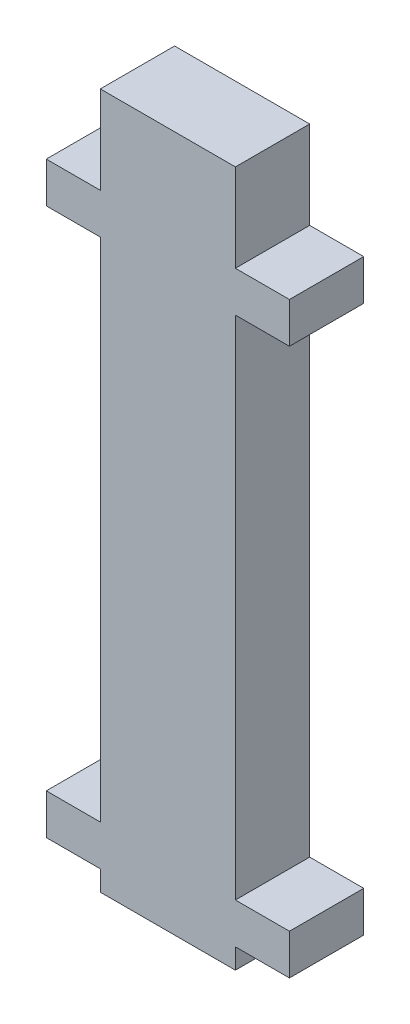
ISO-10303-21;
HEADER;
FILE_DESCRIPTION(('STEP AP214'),'2;1');
FILE_NAME('part.step','',(''),(''),'','','');
FILE_SCHEMA(('AUTOMOTIVE_DESIGN { 1 0 10303 214 1 1 1 1 }'));
ENDSEC;
DATA;
#1=APPLICATION_CONTEXT('core data for automotive mechanical design processes');
#2=APPLICATION_PROTOCOL_DEFINITION('international standard','automotive_design',2000,#1);
#3=PRODUCT_CONTEXT('',#1,'mechanical');
#4=PRODUCT('Part','Part','',(#3));
#5=PRODUCT_RELATED_PRODUCT_CATEGORY('part','',(#4));
#6=PRODUCT_DEFINITION_FORMATION('','',#4);
#7=PRODUCT_DEFINITION_CONTEXT('part definition',#1,'design');
#8=PRODUCT_DEFINITION('design','',#6,#7);
#9=PRODUCT_DEFINITION_SHAPE('','',#8);
#10=(LENGTH_UNIT() NAMED_UNIT(*) SI_UNIT(.MILLI.,.METRE.));
#11=(NAMED_UNIT(*) PLANE_ANGLE_UNIT() SI_UNIT($,.RADIAN.));
#12=(NAMED_UNIT(*) SI_UNIT($,.STERADIAN.) SOLID_ANGLE_UNIT());
#13=UNCERTAINTY_MEASURE_WITH_UNIT(LENGTH_MEASURE(1.E-05),#10,'distance_accuracy_value','');
#14=(GEOMETRIC_REPRESENTATION_CONTEXT(3) GLOBAL_UNCERTAINTY_ASSIGNED_CONTEXT((#13)) GLOBAL_UNIT_ASSIGNED_CONTEXT((#10,
#11,#12)) REPRESENTATION_CONTEXT('',''));
#15=CARTESIAN_POINT('',(0.,0.,0.));
#16=DIRECTION('',(0.,0.,1.));
#17=DIRECTION('',(1.,0.,0.));
#18=AXIS2_PLACEMENT_3D('',#15,#16,#17);
#19=CARTESIAN_POINT('',(0.,0.,11.));
#20=DIRECTION('',(1.,0.,0.));
#21=DIRECTION('',(0.,1.,0.));
#22=AXIS2_PLACEMENT_3D('',#19,#20,#21);
#23=PLANE('',#22);
#24=DIRECTION('',(0.,-1.,0.));
#25=VECTOR('',#24,1.);
#26=CARTESIAN_POINT('',(0.,0.,0.));
#27=LINE('',#26,#25);
#28=CARTESIAN_POINT('',(0.,0.,0.));
#29=VERTEX_POINT('',#28);
#30=CARTESIAN_POINT('',(0.,-3.,0.));
#31=VERTEX_POINT('',#30);
#32=EDGE_CURVE('E201',#29,#31,#27,.T.);
#33=ORIENTED_EDGE('',*,*,#32,.T.);
#34=DIRECTION('',(0.,0.,-1.));
#35=VECTOR('',#34,1.);
#36=CARTESIAN_POINT('',(0.,-3.,11.));
#37=LINE('',#36,#35);
#38=CARTESIAN_POINT('',(0.,-3.,11.));
#39=VERTEX_POINT('',#38);
#40=EDGE_CURVE('E11',#39,#31,#37,.T.);
#41=ORIENTED_EDGE('',*,*,#40,.F.);
#42=DIRECTION('',(0.,-1.,0.));
#43=VECTOR('',#42,1.);
#44=CARTESIAN_POINT('',(0.,0.,11.));
#45=LINE('',#44,#43);
#46=CARTESIAN_POINT('',(0.,0.,11.));
#47=VERTEX_POINT('',#46);
#48=EDGE_CURVE('E240',#47,#39,#45,.T.);
#49=ORIENTED_EDGE('',*,*,#48,.F.);
#50=DIRECTION('',(0.,0.,-1.));
#51=VECTOR('',#50,1.);
#52=CARTESIAN_POINT('',(0.,0.,11.));
#53=LINE('',#52,#51);
#54=EDGE_CURVE('E197',#47,#29,#53,.T.);
#55=ORIENTED_EDGE('',*,*,#54,.T.);
#56=EDGE_LOOP('',(#33,#41,#49,#55));
#57=FACE_BOUND('',#56,.T.);
#58=ADVANCED_FACE('F33',(#57),#23,.F.);
#59=CARTESIAN_POINT('',(0.,-3.,11.));
#60=DIRECTION('',(0.,1.,0.));
#61=DIRECTION('',(-1.,0.,0.));
#62=AXIS2_PLACEMENT_3D('',#59,#60,#61);
#63=PLANE('',#62);
#64=DIRECTION('',(1.,0.,0.));
#65=VECTOR('',#64,1.);
#66=CARTESIAN_POINT('',(0.,-3.,0.));
#67=LINE('',#66,#65);
#68=CARTESIAN_POINT('',(20.,-3.,0.));
#69=VERTEX_POINT('',#68);
#70=EDGE_CURVE('E204',#31,#69,#67,.T.);
#71=ORIENTED_EDGE('',*,*,#70,.T.);
#72=DIRECTION('',(0.,0.,-1.));
#73=VECTOR('',#72,1.);
#74=CARTESIAN_POINT('',(20.,-3.,11.));
#75=LINE('',#74,#73);
#76=CARTESIAN_POINT('',(20.,-3.,11.));
#77=VERTEX_POINT('',#76);
#78=EDGE_CURVE('E41',#77,#69,#75,.T.);
#79=ORIENTED_EDGE('',*,*,#78,.F.);
#80=DIRECTION('',(1.,0.,0.));
#81=VECTOR('',#80,1.);
#82=CARTESIAN_POINT('',(0.,-3.,11.));
#83=LINE('',#82,#81);
#84=EDGE_CURVE('E128',#39,#77,#83,.T.);
#85=ORIENTED_EDGE('',*,*,#84,.F.);
#86=ORIENTED_EDGE('',*,*,#40,.T.);
#87=EDGE_LOOP('',(#71,#79,#85,#86));
#88=FACE_BOUND('',#87,.T.);
#89=ADVANCED_FACE('F358',(#88),#63,.F.);
#90=CARTESIAN_POINT('',(20.,-3.,11.));
#91=DIRECTION('',(-1.,0.,0.));
#92=DIRECTION('',(0.,0.,1.));
#93=AXIS2_PLACEMENT_3D('',#90,#91,#92);
#94=PLANE('',#93);
#95=DIRECTION('',(0.,1.,0.));
#96=VECTOR('',#95,1.);
#97=CARTESIAN_POINT('',(20.,-3.,0.));
#98=LINE('',#97,#96);
#99=CARTESIAN_POINT('',(20.,0.,0.));
#100=VERTEX_POINT('',#99);
#101=EDGE_CURVE('E206',#69,#100,#98,.T.);
#102=ORIENTED_EDGE('',*,*,#101,.T.);
#103=DIRECTION('',(0.,0.,-1.));
#104=VECTOR('',#103,1.);
#105=CARTESIAN_POINT('',(20.,0.,11.));
#106=LINE('',#105,#104);
#107=CARTESIAN_POINT('',(20.,0.,11.));
#108=VERTEX_POINT('',#107);
#109=EDGE_CURVE('E283',#108,#100,#106,.T.);
#110=ORIENTED_EDGE('',*,*,#109,.F.);
#111=DIRECTION('',(0.,1.,0.));
#112=VECTOR('',#111,1.);
#113=CARTESIAN_POINT('',(20.,-3.,11.));
#114=LINE('',#113,#112);
#115=EDGE_CURVE('E291',#77,#108,#114,.T.);
#116=ORIENTED_EDGE('',*,*,#115,.F.);
#117=ORIENTED_EDGE('',*,*,#78,.T.);
#118=EDGE_LOOP('',(#102,#110,#116,#117));
#119=FACE_BOUND('',#118,.T.);
#120=ADVANCED_FACE('F289',(#119),#94,.F.);
#121=CARTESIAN_POINT('',(20.,0.,11.));
#122=DIRECTION('',(0.,1.,0.));
#123=DIRECTION('',(-1.,0.,0.));
#124=AXIS2_PLACEMENT_3D('',#121,#122,#123);
#125=PLANE('',#124);
#126=DIRECTION('',(1.,0.,0.));
#127=VECTOR('',#126,1.);
#128=CARTESIAN_POINT('',(20.,0.,0.));
#129=LINE('',#128,#127);
#130=CARTESIAN_POINT('',(28.,0.,0.));
#131=VERTEX_POINT('',#130);
#132=EDGE_CURVE('E208',#100,#131,#129,.T.);
#133=ORIENTED_EDGE('',*,*,#132,.T.);
#134=DIRECTION('',(0.,0.,-1.));
#135=VECTOR('',#134,1.);
#136=CARTESIAN_POINT('',(28.,0.,11.));
#137=LINE('',#136,#135);
#138=CARTESIAN_POINT('',(28.,0.,11.));
#139=VERTEX_POINT('',#138);
#140=EDGE_CURVE('E280',#139,#131,#137,.T.);
#141=ORIENTED_EDGE('',*,*,#140,.F.);
#142=DIRECTION('',(1.,0.,0.));
#143=VECTOR('',#142,1.);
#144=CARTESIAN_POINT('',(20.,0.,11.));
#145=LINE('',#144,#143);
#146=EDGE_CURVE('E309',#108,#139,#145,.T.);
#147=ORIENTED_EDGE('',*,*,#146,.F.);
#148=ORIENTED_EDGE('',*,*,#109,.T.);
#149=EDGE_LOOP('',(#133,#141,#147,#148));
#150=FACE_BOUND('',#149,.T.);
#151=ADVANCED_FACE('F300',(#150),#125,.F.);
#152=CARTESIAN_POINT('',(28.,0.,11.));
#153=DIRECTION('',(-1.,0.,0.));
#154=DIRECTION('',(0.,0.,1.));
#155=AXIS2_PLACEMENT_3D('',#152,#153,#154);
#156=PLANE('',#155);
#157=DIRECTION('',(0.,1.,0.));
#158=VECTOR('',#157,1.);
#159=CARTESIAN_POINT('',(28.,0.,0.));
#160=LINE('',#159,#158);
#161=CARTESIAN_POINT('',(28.,6.,0.));
#162=VERTEX_POINT('',#161);
#163=EDGE_CURVE('E210',#131,#162,#160,.T.);
#164=ORIENTED_EDGE('',*,*,#163,.T.);
#165=DIRECTION('',(0.,0.,-1.));
#166=VECTOR('',#165,1.);
#167=CARTESIAN_POINT('',(28.,6.,11.));
#168=LINE('',#167,#166);
#169=CARTESIAN_POINT('',(28.,6.,11.));
#170=VERTEX_POINT('',#169);
#171=EDGE_CURVE('E277',#170,#162,#168,.T.);
#172=ORIENTED_EDGE('',*,*,#171,.F.);
#173=DIRECTION('',(0.,1.,0.));
#174=VECTOR('',#173,1.);
#175=CARTESIAN_POINT('',(28.,0.,11.));
#176=LINE('',#175,#174);
#177=EDGE_CURVE('E306',#139,#170,#176,.T.);
#178=ORIENTED_EDGE('',*,*,#177,.F.);
#179=ORIENTED_EDGE('',*,*,#140,.T.);
#180=EDGE_LOOP('',(#164,#172,#178,#179));
#181=FACE_BOUND('',#180,.T.);
#182=ADVANCED_FACE('F304',(#181),#156,.F.);
#183=CARTESIAN_POINT('',(28.,6.,11.));
#184=DIRECTION('',(0.,-1.,0.));
#185=DIRECTION('',(1.,0.,0.));
#186=AXIS2_PLACEMENT_3D('',#183,#184,#185);
#187=PLANE('',#186);
#188=DIRECTION('',(-1.,0.,0.));
#189=VECTOR('',#188,1.);
#190=CARTESIAN_POINT('',(28.,6.,0.));
#191=LINE('',#190,#189);
#192=CARTESIAN_POINT('',(20.,6.,0.));
#193=VERTEX_POINT('',#192);
#194=EDGE_CURVE('E212',#162,#193,#191,.T.);
#195=ORIENTED_EDGE('',*,*,#194,.T.);
#196=DIRECTION('',(0.,0.,-1.));
#197=VECTOR('',#196,1.);
#198=CARTESIAN_POINT('',(20.,6.,11.));
#199=LINE('',#198,#197);
#200=CARTESIAN_POINT('',(20.,6.,11.));
#201=VERTEX_POINT('',#200);
#202=EDGE_CURVE('E274',#201,#193,#199,.T.);
#203=ORIENTED_EDGE('',*,*,#202,.F.);
#204=DIRECTION('',(-1.,0.,0.));
#205=VECTOR('',#204,1.);
#206=CARTESIAN_POINT('',(28.,6.,11.));
#207=LINE('',#206,#205);
#208=EDGE_CURVE('E308',#170,#201,#207,.T.);
#209=ORIENTED_EDGE('',*,*,#208,.F.);
#210=ORIENTED_EDGE('',*,*,#171,.T.);
#211=EDGE_LOOP('',(#195,#203,#209,#210));
#212=FACE_BOUND('',#211,.T.);
#213=ADVANCED_FACE('F371',(#212),#187,.F.);
#214=CARTESIAN_POINT('',(20.,81.,11.));
#215=DIRECTION('',(-1.,0.,0.));
#216=DIRECTION('',(0.,-1.,0.));
#217=AXIS2_PLACEMENT_3D('',#214,#215,#216);
#218=PLANE('',#217);
#219=DIRECTION('',(0.,1.,0.));
#220=VECTOR('',#219,1.);
#221=CARTESIAN_POINT('',(20.,81.,0.));
#222=LINE('',#221,#220);
#223=CARTESIAN_POINT('',(20.,81.,0.));
#224=VERTEX_POINT('',#223);
#225=EDGE_CURVE('E214',#193,#224,#222,.T.);
#226=ORIENTED_EDGE('',*,*,#225,.T.);
#227=DIRECTION('',(0.,0.,-1.));
#228=VECTOR('',#227,1.);
#229=CARTESIAN_POINT('',(20.,81.,11.));
#230=LINE('',#229,#228);
#231=CARTESIAN_POINT('',(20.,81.,11.));
#232=VERTEX_POINT('',#231);
#233=EDGE_CURVE('E271',#232,#224,#230,.T.);
#234=ORIENTED_EDGE('',*,*,#233,.F.);
#235=DIRECTION('',(0.,1.,0.));
#236=VECTOR('',#235,1.);
#237=CARTESIAN_POINT('',(20.,81.,11.));
#238=LINE('',#237,#236);
#239=EDGE_CURVE('E311',#201,#232,#238,.T.);
#240=ORIENTED_EDGE('',*,*,#239,.F.);
#241=ORIENTED_EDGE('',*,*,#202,.T.);
#242=EDGE_LOOP('',(#226,#234,#240,#241));
#243=FACE_BOUND('',#242,.T.);
#244=ADVANCED_FACE('F374',(#243),#218,.F.);
#245=CARTESIAN_POINT('',(20.,81.,11.));
#246=DIRECTION('',(0.,1.,0.));
#247=DIRECTION('',(0.,0.,1.));
#248=AXIS2_PLACEMENT_3D('',#245,#246,#247);
#249=PLANE('',#248);
#250=DIRECTION('',(1.,0.,0.));
#251=VECTOR('',#250,1.);
#252=CARTESIAN_POINT('',(20.,81.,0.));
#253=LINE('',#252,#251);
#254=CARTESIAN_POINT('',(28.,81.,0.));
#255=VERTEX_POINT('',#254);
#256=EDGE_CURVE('E216',#224,#255,#253,.T.);
#257=ORIENTED_EDGE('',*,*,#256,.T.);
#258=DIRECTION('',(0.,0.,-1.));
#259=VECTOR('',#258,1.);
#260=CARTESIAN_POINT('',(28.,81.,11.));
#261=LINE('',#260,#259);
#262=CARTESIAN_POINT('',(28.,81.,11.));
#263=VERTEX_POINT('',#262);
#264=EDGE_CURVE('E268',#263,#255,#261,.T.);
#265=ORIENTED_EDGE('',*,*,#264,.F.);
#266=DIRECTION('',(1.,0.,0.));
#267=VECTOR('',#266,1.);
#268=CARTESIAN_POINT('',(20.,81.,11.));
#269=LINE('',#268,#267);
#270=EDGE_CURVE('E317',#232,#263,#269,.T.);
#271=ORIENTED_EDGE('',*,*,#270,.F.);
#272=ORIENTED_EDGE('',*,*,#233,.T.);
#273=EDGE_LOOP('',(#257,#265,#271,#272));
#274=FACE_BOUND('',#273,.T.);
#275=ADVANCED_FACE('F378',(#274),#249,.F.);
#276=CARTESIAN_POINT('',(28.,81.,11.));
#277=DIRECTION('',(-1.,0.,0.));
#278=DIRECTION('',(0.,-1.,0.));
#279=AXIS2_PLACEMENT_3D('',#276,#277,#278);
#280=PLANE('',#279);
#281=DIRECTION('',(0.,1.,0.));
#282=VECTOR('',#281,1.);
#283=CARTESIAN_POINT('',(28.,81.,0.));
#284=LINE('',#283,#282);
#285=CARTESIAN_POINT('',(28.,87.,0.));
#286=VERTEX_POINT('',#285);
#287=EDGE_CURVE('E218',#255,#286,#284,.T.);
#288=ORIENTED_EDGE('',*,*,#287,.T.);
#289=DIRECTION('',(0.,0.,-1.));
#290=VECTOR('',#289,1.);
#291=CARTESIAN_POINT('',(28.,87.,11.));
#292=LINE('',#291,#290);
#293=CARTESIAN_POINT('',(28.,87.,11.));
#294=VERTEX_POINT('',#293);
#295=EDGE_CURVE('E265',#294,#286,#292,.T.);
#296=ORIENTED_EDGE('',*,*,#295,.F.);
#297=DIRECTION('',(0.,1.,0.));
#298=VECTOR('',#297,1.);
#299=CARTESIAN_POINT('',(28.,81.,11.));
#300=LINE('',#299,#298);
#301=EDGE_CURVE('E319',#263,#294,#300,.T.);
#302=ORIENTED_EDGE('',*,*,#301,.F.);
#303=ORIENTED_EDGE('',*,*,#264,.T.);
#304=EDGE_LOOP('',(#288,#296,#302,#303));
#305=FACE_BOUND('',#304,.T.);
#306=ADVANCED_FACE('F382',(#305),#280,.F.);
#307=CARTESIAN_POINT('',(28.,87.,11.));
#308=DIRECTION('',(0.,-1.,0.));
#309=DIRECTION('',(0.,0.,-1.));
#310=AXIS2_PLACEMENT_3D('',#307,#308,#309);
#311=PLANE('',#310);
#312=DIRECTION('',(-1.,0.,0.));
#313=VECTOR('',#312,1.);
#314=CARTESIAN_POINT('',(28.,87.,0.));
#315=LINE('',#314,#313);
#316=CARTESIAN_POINT('',(20.,87.,0.));
#317=VERTEX_POINT('',#316);
#318=EDGE_CURVE('E220',#286,#317,#315,.T.);
#319=ORIENTED_EDGE('',*,*,#318,.T.);
#320=DIRECTION('',(0.,0.,-1.));
#321=VECTOR('',#320,1.);
#322=CARTESIAN_POINT('',(20.,87.,11.));
#323=LINE('',#322,#321);
#324=CARTESIAN_POINT('',(20.,87.,11.));
#325=VERTEX_POINT('',#324);
#326=EDGE_CURVE('E262',#325,#317,#323,.T.);
#327=ORIENTED_EDGE('',*,*,#326,.F.);
#328=DIRECTION('',(-1.,0.,0.));
#329=VECTOR('',#328,1.);
#330=CARTESIAN_POINT('',(28.,87.,11.));
#331=LINE('',#330,#329);
#332=EDGE_CURVE('E321',#294,#325,#331,.T.);
#333=ORIENTED_EDGE('',*,*,#332,.F.);
#334=ORIENTED_EDGE('',*,*,#295,.T.);
#335=EDGE_LOOP('',(#319,#327,#333,#334));
#336=FACE_BOUND('',#335,.T.);
#337=ADVANCED_FACE('F386',(#336),#311,.F.);
#338=CARTESIAN_POINT('',(20.,87.,11.));
#339=DIRECTION('',(-1.,0.,0.));
#340=DIRECTION('',(0.,0.,1.));
#341=AXIS2_PLACEMENT_3D('',#338,#339,#340);
#342=PLANE('',#341);
#343=DIRECTION('',(0.,1.,0.));
#344=VECTOR('',#343,1.);
#345=CARTESIAN_POINT('',(20.,87.,0.));
#346=LINE('',#345,#344);
#347=CARTESIAN_POINT('',(20.,100.,0.));
#348=VERTEX_POINT('',#347);
#349=EDGE_CURVE('E222',#317,#348,#346,.T.);
#350=ORIENTED_EDGE('',*,*,#349,.T.);
#351=DIRECTION('',(0.,0.,-1.));
#352=VECTOR('',#351,1.);
#353=CARTESIAN_POINT('',(20.,100.,11.));
#354=LINE('',#353,#352);
#355=CARTESIAN_POINT('',(20.,100.,11.));
#356=VERTEX_POINT('',#355);
#357=EDGE_CURVE('E259',#356,#348,#354,.T.);
#358=ORIENTED_EDGE('',*,*,#357,.F.);
#359=DIRECTION('',(0.,1.,0.));
#360=VECTOR('',#359,1.);
#361=CARTESIAN_POINT('',(20.,87.,11.));
#362=LINE('',#361,#360);
#363=EDGE_CURVE('E323',#325,#356,#362,.T.);
#364=ORIENTED_EDGE('',*,*,#363,.F.);
#365=ORIENTED_EDGE('',*,*,#326,.T.);
#366=EDGE_LOOP('',(#350,#358,#364,#365));
#367=FACE_BOUND('',#366,.T.);
#368=ADVANCED_FACE('F390',(#367),#342,.F.);
#369=CARTESIAN_POINT('',(0.,100.,11.));
#370=DIRECTION('',(0.,-1.,0.));
#371=DIRECTION('',(0.,0.,-1.));
#372=AXIS2_PLACEMENT_3D('',#369,#370,#371);
#373=PLANE('',#372);
#374=DIRECTION('',(-1.,0.,0.));
#375=VECTOR('',#374,1.);
#376=CARTESIAN_POINT('',(0.,100.,0.));
#377=LINE('',#376,#375);
#378=CARTESIAN_POINT('',(0.,100.,0.));
#379=VERTEX_POINT('',#378);
#380=EDGE_CURVE('E225',#348,#379,#377,.T.);
#381=ORIENTED_EDGE('',*,*,#380,.T.);
#382=DIRECTION('',(0.,0.,-1.));
#383=VECTOR('',#382,1.);
#384=CARTESIAN_POINT('',(0.,100.,11.));
#385=LINE('',#384,#383);
#386=CARTESIAN_POINT('',(0.,100.,11.));
#387=VERTEX_POINT('',#386);
#388=EDGE_CURVE('E256',#387,#379,#385,.T.);
#389=ORIENTED_EDGE('',*,*,#388,.F.);
#390=DIRECTION('',(-1.,0.,0.));
#391=VECTOR('',#390,1.);
#392=CARTESIAN_POINT('',(15.,100.,11.));
#393=LINE('',#392,#391);
#394=EDGE_CURVE('E325',#356,#387,#393,.T.);
#395=ORIENTED_EDGE('',*,*,#394,.F.);
#396=ORIENTED_EDGE('',*,*,#357,.T.);
#397=EDGE_LOOP('',(#381,#389,#395,#396));
#398=FACE_BOUND('',#397,.T.);
#399=ADVANCED_FACE('F394',(#398),#373,.F.);
#400=CARTESIAN_POINT('',(0.,100.,11.));
#401=DIRECTION('',(1.,0.,0.));
#402=DIRECTION('',(0.,1.,0.));
#403=AXIS2_PLACEMENT_3D('',#400,#401,#402);
#404=PLANE('',#403);
#405=DIRECTION('',(0.,-1.,0.));
#406=VECTOR('',#405,1.);
#407=CARTESIAN_POINT('',(0.,100.,0.));
#408=LINE('',#407,#406);
#409=CARTESIAN_POINT('',(0.,87.,0.));
#410=VERTEX_POINT('',#409);
#411=EDGE_CURVE('E227',#379,#410,#408,.T.);
#412=ORIENTED_EDGE('',*,*,#411,.T.);
#413=DIRECTION('',(0.,0.,-1.));
#414=VECTOR('',#413,1.);
#415=CARTESIAN_POINT('',(0.,87.,11.));
#416=LINE('',#415,#414);
#417=CARTESIAN_POINT('',(0.,87.,11.));
#418=VERTEX_POINT('',#417);
#419=EDGE_CURVE('E253',#418,#410,#416,.T.);
#420=ORIENTED_EDGE('',*,*,#419,.F.);
#421=DIRECTION('',(0.,-1.,0.));
#422=VECTOR('',#421,1.);
#423=CARTESIAN_POINT('',(0.,100.,11.));
#424=LINE('',#423,#422);
#425=EDGE_CURVE('E327',#387,#418,#424,.T.);
#426=ORIENTED_EDGE('',*,*,#425,.F.);
#427=ORIENTED_EDGE('',*,*,#388,.T.);
#428=EDGE_LOOP('',(#412,#420,#426,#427));
#429=FACE_BOUND('',#428,.T.);
#430=ADVANCED_FACE('F398',(#429),#404,.F.);
#431=CARTESIAN_POINT('',(0.,87.,11.));
#432=DIRECTION('',(0.,-1.,0.));
#433=DIRECTION('',(0.,0.,-1.));
#434=AXIS2_PLACEMENT_3D('',#431,#432,#433);
#435=PLANE('',#434);
#436=DIRECTION('',(-1.,0.,0.));
#437=VECTOR('',#436,1.);
#438=CARTESIAN_POINT('',(0.,87.,0.));
#439=LINE('',#438,#437);
#440=CARTESIAN_POINT('',(-8.00000000000001,87.,0.));
#441=VERTEX_POINT('',#440);
#442=EDGE_CURVE('E229',#410,#441,#439,.T.);
#443=ORIENTED_EDGE('',*,*,#442,.T.);
#444=DIRECTION('',(0.,0.,-1.));
#445=VECTOR('',#444,1.);
#446=CARTESIAN_POINT('',(-8.00000000000001,87.,11.));
#447=LINE('',#446,#445);
#448=CARTESIAN_POINT('',(-8.00000000000001,87.,11.));
#449=VERTEX_POINT('',#448);
#450=EDGE_CURVE('E250',#449,#441,#447,.T.);
#451=ORIENTED_EDGE('',*,*,#450,.F.);
#452=DIRECTION('',(-1.,0.,0.));
#453=VECTOR('',#452,1.);
#454=CARTESIAN_POINT('',(0.,87.,11.));
#455=LINE('',#454,#453);
#456=EDGE_CURVE('E329',#418,#449,#455,.T.);
#457=ORIENTED_EDGE('',*,*,#456,.F.);
#458=ORIENTED_EDGE('',*,*,#419,.T.);
#459=EDGE_LOOP('',(#443,#451,#457,#458));
#460=FACE_BOUND('',#459,.T.);
#461=ADVANCED_FACE('F402',(#460),#435,.F.);
#462=CARTESIAN_POINT('',(-8.00000000000001,87.,11.));
#463=DIRECTION('',(1.,0.,0.));
#464=DIRECTION('',(0.,1.,0.));
#465=AXIS2_PLACEMENT_3D('',#462,#463,#464);
#466=PLANE('',#465);
#467=DIRECTION('',(0.,-1.,0.));
#468=VECTOR('',#467,1.);
#469=CARTESIAN_POINT('',(-8.00000000000001,87.,0.));
#470=LINE('',#469,#468);
#471=CARTESIAN_POINT('',(-8.00000000000001,81.,0.));
#472=VERTEX_POINT('',#471);
#473=EDGE_CURVE('E231',#441,#472,#470,.T.);
#474=ORIENTED_EDGE('',*,*,#473,.T.);
#475=DIRECTION('',(0.,0.,-1.));
#476=VECTOR('',#475,1.);
#477=CARTESIAN_POINT('',(-8.00000000000001,81.,11.));
#478=LINE('',#477,#476);
#479=CARTESIAN_POINT('',(-8.00000000000001,81.,11.));
#480=VERTEX_POINT('',#479);
#481=EDGE_CURVE('E247',#480,#472,#478,.T.);
#482=ORIENTED_EDGE('',*,*,#481,.F.);
#483=DIRECTION('',(0.,-1.,0.));
#484=VECTOR('',#483,1.);
#485=CARTESIAN_POINT('',(-8.00000000000001,87.,11.));
#486=LINE('',#485,#484);
#487=EDGE_CURVE('E331',#449,#480,#486,.T.);
#488=ORIENTED_EDGE('',*,*,#487,.F.);
#489=ORIENTED_EDGE('',*,*,#450,.T.);
#490=EDGE_LOOP('',(#474,#482,#488,#489));
#491=FACE_BOUND('',#490,.T.);
#492=ADVANCED_FACE('F406',(#491),#466,.F.);
#493=CARTESIAN_POINT('',(-8.00000000000001,81.,11.));
#494=DIRECTION('',(0.,1.,0.));
#495=DIRECTION('',(0.,0.,1.));
#496=AXIS2_PLACEMENT_3D('',#493,#494,#495);
#497=PLANE('',#496);
#498=DIRECTION('',(1.,0.,0.));
#499=VECTOR('',#498,1.);
#500=CARTESIAN_POINT('',(-8.00000000000001,81.,0.));
#501=LINE('',#500,#499);
#502=CARTESIAN_POINT('',(0.,81.,0.));
#503=VERTEX_POINT('',#502);
#504=EDGE_CURVE('E233',#472,#503,#501,.T.);
#505=ORIENTED_EDGE('',*,*,#504,.T.);
#506=DIRECTION('',(0.,0.,-1.));
#507=VECTOR('',#506,1.);
#508=CARTESIAN_POINT('',(0.,81.,11.));
#509=LINE('',#508,#507);
#510=CARTESIAN_POINT('',(0.,81.,11.));
#511=VERTEX_POINT('',#510);
#512=EDGE_CURVE('E244',#511,#503,#509,.T.);
#513=ORIENTED_EDGE('',*,*,#512,.F.);
#514=DIRECTION('',(1.,0.,0.));
#515=VECTOR('',#514,1.);
#516=CARTESIAN_POINT('',(-8.00000000000001,81.,11.));
#517=LINE('',#516,#515);
#518=EDGE_CURVE('E333',#480,#511,#517,.T.);
#519=ORIENTED_EDGE('',*,*,#518,.F.);
#520=ORIENTED_EDGE('',*,*,#481,.T.);
#521=EDGE_LOOP('',(#505,#513,#519,#520));
#522=FACE_BOUND('',#521,.T.);
#523=ADVANCED_FACE('F339',(#522),#497,.F.);
#524=CARTESIAN_POINT('',(0.,81.,11.));
#525=DIRECTION('',(1.,0.,0.));
#526=DIRECTION('',(0.,1.,0.));
#527=AXIS2_PLACEMENT_3D('',#524,#525,#526);
#528=PLANE('',#527);
#529=DIRECTION('',(0.,-1.,0.));
#530=VECTOR('',#529,1.);
#531=CARTESIAN_POINT('',(0.,81.,0.));
#532=LINE('',#531,#530);
#533=CARTESIAN_POINT('',(0.,6.,0.));
#534=VERTEX_POINT('',#533);
#535=EDGE_CURVE('E235',#503,#534,#532,.T.);
#536=ORIENTED_EDGE('',*,*,#535,.T.);
#537=DIRECTION('',(0.,0.,-1.));
#538=VECTOR('',#537,1.);
#539=CARTESIAN_POINT('',(0.,6.,11.));
#540=LINE('',#539,#538);
#541=CARTESIAN_POINT('',(0.,6.,11.));
#542=VERTEX_POINT('',#541);
#543=EDGE_CURVE('E192',#542,#534,#540,.T.);
#544=ORIENTED_EDGE('',*,*,#543,.F.);
#545=DIRECTION('',(0.,-1.,0.));
#546=VECTOR('',#545,1.);
#547=CARTESIAN_POINT('',(0.,81.,11.));
#548=LINE('',#547,#546);
#549=EDGE_CURVE('E183',#511,#542,#548,.T.);
#550=ORIENTED_EDGE('',*,*,#549,.F.);
#551=ORIENTED_EDGE('',*,*,#512,.T.);
#552=EDGE_LOOP('',(#536,#544,#550,#551));
#553=FACE_BOUND('',#552,.T.);
#554=ADVANCED_FACE('F343',(#553),#528,.F.);
#555=CARTESIAN_POINT('',(0.,6.,11.));
#556=DIRECTION('',(0.,-1.,0.));
#557=DIRECTION('',(1.,0.,0.));
#558=AXIS2_PLACEMENT_3D('',#555,#556,#557);
#559=PLANE('',#558);
#560=DIRECTION('',(-1.,0.,0.));
#561=VECTOR('',#560,1.);
#562=CARTESIAN_POINT('',(0.,6.,0.));
#563=LINE('',#562,#561);
#564=CARTESIAN_POINT('',(-8.,6.,0.));
#565=VERTEX_POINT('',#564);
#566=EDGE_CURVE('E191',#534,#565,#563,.T.);
#567=ORIENTED_EDGE('',*,*,#566,.T.);
#568=DIRECTION('',(0.,0.,-1.));
#569=VECTOR('',#568,1.);
#570=CARTESIAN_POINT('',(-8.,6.,11.));
#571=LINE('',#570,#569);
#572=CARTESIAN_POINT('',(-8.,6.,11.));
#573=VERTEX_POINT('',#572);
#574=EDGE_CURVE('E188',#573,#565,#571,.T.);
#575=ORIENTED_EDGE('',*,*,#574,.F.);
#576=DIRECTION('',(-1.,0.,0.));
#577=VECTOR('',#576,1.);
#578=CARTESIAN_POINT('',(0.,6.,11.));
#579=LINE('',#578,#577);
#580=EDGE_CURVE('E177',#542,#573,#579,.T.);
#581=ORIENTED_EDGE('',*,*,#580,.F.);
#582=ORIENTED_EDGE('',*,*,#543,.T.);
#583=EDGE_LOOP('',(#567,#575,#581,#582));
#584=FACE_BOUND('',#583,.T.);
#585=ADVANCED_FACE('F189',(#584),#559,.F.);
#586=CARTESIAN_POINT('',(-8.,6.,11.));
#587=DIRECTION('',(1.,0.,0.));
#588=DIRECTION('',(0.,0.,-1.));
#589=AXIS2_PLACEMENT_3D('',#586,#587,#588);
#590=PLANE('',#589);
#591=DIRECTION('',(0.,-1.,0.));
#592=VECTOR('',#591,1.);
#593=CARTESIAN_POINT('',(-8.,6.,0.));
#594=LINE('',#593,#592);
#595=CARTESIAN_POINT('',(-8.,0.,0.));
#596=VERTEX_POINT('',#595);
#597=EDGE_CURVE('E114',#565,#596,#594,.T.);
#598=ORIENTED_EDGE('',*,*,#597,.T.);
#599=DIRECTION('',(0.,0.,-1.));
#600=VECTOR('',#599,1.);
#601=CARTESIAN_POINT('',(-8.,0.,11.));
#602=LINE('',#601,#600);
#603=CARTESIAN_POINT('',(-8.,0.,11.));
#604=VERTEX_POINT('',#603);
#605=EDGE_CURVE('E193',#604,#596,#602,.T.);
#606=ORIENTED_EDGE('',*,*,#605,.F.);
#607=DIRECTION('',(0.,-1.,0.));
#608=VECTOR('',#607,1.);
#609=CARTESIAN_POINT('',(-8.,6.,11.));
#610=LINE('',#609,#608);
#611=EDGE_CURVE('E181',#573,#604,#610,.T.);
#612=ORIENTED_EDGE('',*,*,#611,.F.);
#613=ORIENTED_EDGE('',*,*,#574,.T.);
#614=EDGE_LOOP('',(#598,#606,#612,#613));
#615=FACE_BOUND('',#614,.T.);
#616=ADVANCED_FACE('F195',(#615),#590,.F.);
#617=CARTESIAN_POINT('',(-8.,0.,11.));
#618=DIRECTION('',(0.,1.,0.));
#619=DIRECTION('',(0.,0.,1.));
#620=AXIS2_PLACEMENT_3D('',#617,#618,#619);
#621=PLANE('',#620);
#622=DIRECTION('',(1.,0.,0.));
#623=VECTOR('',#622,1.);
#624=CARTESIAN_POINT('',(-8.,0.,0.));
#625=LINE('',#624,#623);
#626=EDGE_CURVE('E120',#596,#29,#625,.T.);
#627=ORIENTED_EDGE('',*,*,#626,.T.);
#628=ORIENTED_EDGE('',*,*,#54,.F.);
#629=DIRECTION('',(1.,0.,0.));
#630=VECTOR('',#629,1.);
#631=CARTESIAN_POINT('',(-8.,0.,11.));
#632=LINE('',#631,#630);
#633=EDGE_CURVE('E49',#604,#47,#632,.T.);
#634=ORIENTED_EDGE('',*,*,#633,.F.);
#635=ORIENTED_EDGE('',*,*,#605,.T.);
#636=EDGE_LOOP('',(#627,#628,#634,#635));
#637=FACE_BOUND('',#636,.T.);
#638=ADVANCED_FACE('F347',(#637),#621,.F.);
#639=CARTESIAN_POINT('',(0.,0.,11.));
#640=DIRECTION('',(0.,0.,1.));
#641=DIRECTION('',(1.,0.,0.));
#642=AXIS2_PLACEMENT_3D('',#639,#640,#641);
#643=PLANE('',#642);
#644=ORIENTED_EDGE('',*,*,#48,.T.);
#645=ORIENTED_EDGE('',*,*,#84,.T.);
#646=ORIENTED_EDGE('',*,*,#115,.T.);
#647=ORIENTED_EDGE('',*,*,#146,.T.);
#648=ORIENTED_EDGE('',*,*,#177,.T.);
#649=ORIENTED_EDGE('',*,*,#208,.T.);
#650=ORIENTED_EDGE('',*,*,#239,.T.);
#651=ORIENTED_EDGE('',*,*,#270,.T.);
#652=ORIENTED_EDGE('',*,*,#301,.T.);
#653=ORIENTED_EDGE('',*,*,#332,.T.);
#654=ORIENTED_EDGE('',*,*,#363,.T.);
#655=ORIENTED_EDGE('',*,*,#394,.T.);
#656=ORIENTED_EDGE('',*,*,#425,.T.);
#657=ORIENTED_EDGE('',*,*,#456,.T.);
#658=ORIENTED_EDGE('',*,*,#487,.T.);
#659=ORIENTED_EDGE('',*,*,#518,.T.);
#660=ORIENTED_EDGE('',*,*,#549,.T.);
#661=ORIENTED_EDGE('',*,*,#580,.T.);
#662=ORIENTED_EDGE('',*,*,#611,.T.);
#663=ORIENTED_EDGE('',*,*,#633,.T.);
#664=EDGE_LOOP('',(#644,#645,#646,#647,#648,#649,#650,#651,#652,#653,#654,#655,#656,#657,#658,
#659,#660,#661,#662,#663));
#665=FACE_BOUND('',#664,.T.);
#666=ADVANCED_FACE('F179',(#665),#643,.T.);
#667=CARTESIAN_POINT('',(0.,0.,0.));
#668=DIRECTION('',(0.,0.,1.));
#669=DIRECTION('',(1.,0.,0.));
#670=AXIS2_PLACEMENT_3D('',#667,#668,#669);
#671=PLANE('',#670);
#672=ORIENTED_EDGE('',*,*,#32,.F.);
#673=ORIENTED_EDGE('',*,*,#626,.F.);
#674=ORIENTED_EDGE('',*,*,#597,.F.);
#675=ORIENTED_EDGE('',*,*,#566,.F.);
#676=ORIENTED_EDGE('',*,*,#535,.F.);
#677=ORIENTED_EDGE('',*,*,#504,.F.);
#678=ORIENTED_EDGE('',*,*,#473,.F.);
#679=ORIENTED_EDGE('',*,*,#442,.F.);
#680=ORIENTED_EDGE('',*,*,#411,.F.);
#681=ORIENTED_EDGE('',*,*,#380,.F.);
#682=ORIENTED_EDGE('',*,*,#349,.F.);
#683=ORIENTED_EDGE('',*,*,#318,.F.);
#684=ORIENTED_EDGE('',*,*,#287,.F.);
#685=ORIENTED_EDGE('',*,*,#256,.F.);
#686=ORIENTED_EDGE('',*,*,#225,.F.);
#687=ORIENTED_EDGE('',*,*,#194,.F.);
#688=ORIENTED_EDGE('',*,*,#163,.F.);
#689=ORIENTED_EDGE('',*,*,#132,.F.);
#690=ORIENTED_EDGE('',*,*,#101,.F.);
#691=ORIENTED_EDGE('',*,*,#70,.F.);
#692=EDGE_LOOP('',(#672,#673,#674,#675,#676,#677,#678,#679,#680,#681,#682,#683,#684,#685,#686,
#687,#688,#689,#690,#691));
#693=FACE_BOUND('',#692,.T.);
#694=ADVANCED_FACE('F295',(#693),#671,.F.);
#695=CLOSED_SHELL('',(#58,#89,#120,#151,#182,#213,#244,#275,#306,#337,#368,#399,#430,#461,#492,
#523,#554,#585,#616,#638,#666,#694));
#696=MANIFOLD_SOLID_BREP('B2',#695);
#697=ADVANCED_BREP_SHAPE_REPRESENTATION('',(#18,#696),#14);
#698=SHAPE_DEFINITION_REPRESENTATION(#9,#697);
ENDSEC;
END-ISO-10303-21;
